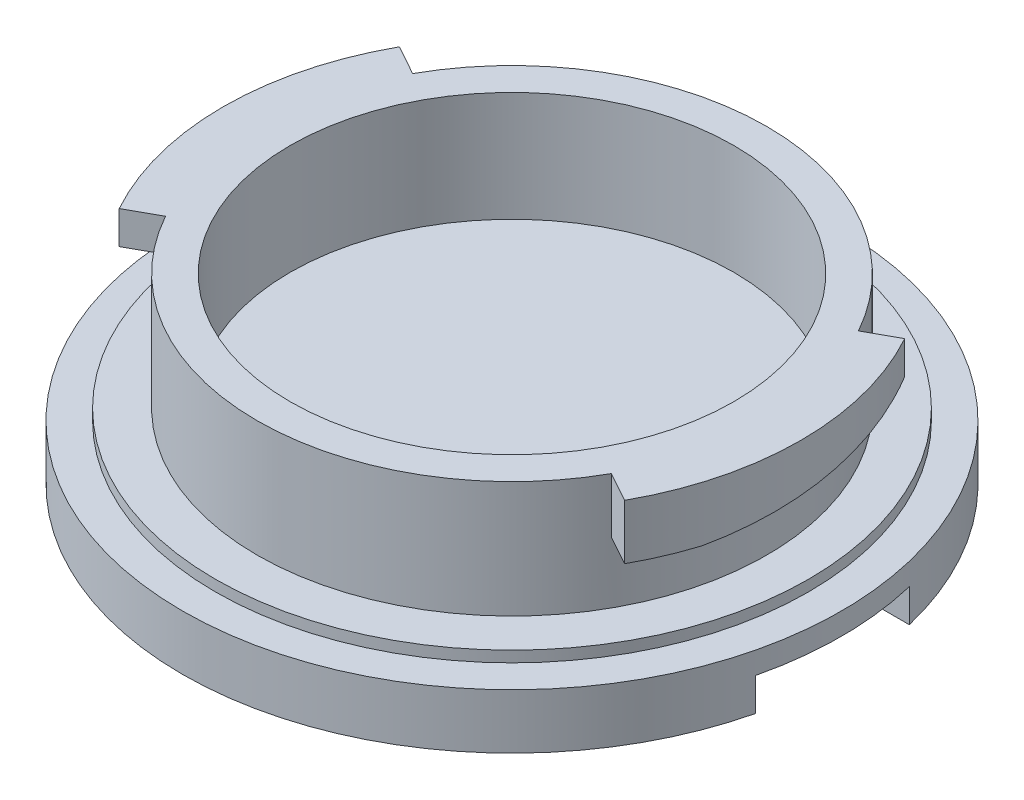
ISO-10303-21;
HEADER;
FILE_DESCRIPTION(('STEP AP214'),'2;1');
FILE_NAME('part.step','',(''),(''),'','','');
FILE_SCHEMA(('AUTOMOTIVE_DESIGN { 1 0 10303 214 1 1 1 1 }'));
ENDSEC;
DATA;
#1=APPLICATION_CONTEXT('core data for automotive mechanical design processes');
#2=APPLICATION_PROTOCOL_DEFINITION('international standard','automotive_design',2000,#1);
#3=PRODUCT_CONTEXT('',#1,'mechanical');
#4=PRODUCT('Part','Part','',(#3));
#5=PRODUCT_RELATED_PRODUCT_CATEGORY('part','',(#4));
#6=PRODUCT_DEFINITION_FORMATION('','',#4);
#7=PRODUCT_DEFINITION_CONTEXT('part definition',#1,'design');
#8=PRODUCT_DEFINITION('design','',#6,#7);
#9=PRODUCT_DEFINITION_SHAPE('','',#8);
#10=(LENGTH_UNIT() NAMED_UNIT(*) SI_UNIT(.MILLI.,.METRE.));
#11=(NAMED_UNIT(*) PLANE_ANGLE_UNIT() SI_UNIT($,.RADIAN.));
#12=(NAMED_UNIT(*) SI_UNIT($,.STERADIAN.) SOLID_ANGLE_UNIT());
#13=UNCERTAINTY_MEASURE_WITH_UNIT(LENGTH_MEASURE(1.E-05),#10,'distance_accuracy_value','');
#14=(GEOMETRIC_REPRESENTATION_CONTEXT(3) GLOBAL_UNCERTAINTY_ASSIGNED_CONTEXT((#13)) GLOBAL_UNIT_ASSIGNED_CONTEXT((#10,
#11,#12)) REPRESENTATION_CONTEXT('',''));
#15=CARTESIAN_POINT('',(0.,0.,0.));
#16=DIRECTION('',(0.,0.,1.));
#17=DIRECTION('',(1.,0.,0.));
#18=AXIS2_PLACEMENT_3D('',#15,#16,#17);
#19=CARTESIAN_POINT('',(0.,0.,0.));
#20=DIRECTION('',(0.,1.,0.));
#21=DIRECTION('',(0.,0.,1.));
#22=AXIS2_PLACEMENT_3D('',#19,#20,#21);
#23=PLANE('',#22);
#24=CARTESIAN_POINT('',(0.,0.,0.));
#25=DIRECTION('',(0.,-1.,0.));
#26=DIRECTION('',(0.,0.,-1.));
#27=AXIS2_PLACEMENT_3D('',#24,#25,#26);
#28=CIRCLE('',#27,10.);
#29=CARTESIAN_POINT('',(9.79795897113271,0.,2.));
#30=VERTEX_POINT('',#29);
#31=CARTESIAN_POINT('',(-9.79795897113271,0.,2.));
#32=VERTEX_POINT('',#31);
#33=EDGE_CURVE('E294',#30,#32,#28,.T.);
#34=ORIENTED_EDGE('',*,*,#33,.F.);
#35=DIRECTION('',(1.,0.,0.));
#36=VECTOR('',#35,1.);
#37=CARTESIAN_POINT('',(0.,0.,2.));
#38=LINE('',#37,#36);
#39=EDGE_CURVE('E298',#32,#30,#38,.T.);
#40=ORIENTED_EDGE('',*,*,#39,.F.);
#41=EDGE_LOOP('',(#34,#40));
#42=FACE_BOUND('',#41,.T.);
#43=DIRECTION('',(1.,0.,0.));
#44=VECTOR('',#43,1.);
#45=CARTESIAN_POINT('',(0.,0.,-2.));
#46=LINE('',#45,#44);
#47=CARTESIAN_POINT('',(-9.79795897113271,0.,-2.));
#48=VERTEX_POINT('',#47);
#49=CARTESIAN_POINT('',(9.79795897113271,0.,-2.));
#50=VERTEX_POINT('',#49);
#51=EDGE_CURVE('E284',#48,#50,#46,.T.);
#52=ORIENTED_EDGE('',*,*,#51,.T.);
#53=CARTESIAN_POINT('',(0.,0.,0.));
#54=DIRECTION('',(0.,-1.,0.));
#55=DIRECTION('',(0.,0.,-1.));
#56=AXIS2_PLACEMENT_3D('',#53,#54,#55);
#57=CIRCLE('',#56,10.);
#58=EDGE_CURVE('E311',#48,#50,#57,.T.);
#59=ORIENTED_EDGE('',*,*,#58,.F.);
#60=EDGE_LOOP('',(#52,#59));
#61=FACE_BOUND('',#60,.T.);
#62=DIRECTION('',(1.,0.,0.));
#63=VECTOR('',#62,1.);
#64=CARTESIAN_POINT('',(0.,0.,3.5));
#65=LINE('',#64,#63);
#66=CARTESIAN_POINT('',(13.,0.,3.5));
#67=VERTEX_POINT('',#66);
#68=CARTESIAN_POINT('',(14.5859521458148,0.,3.5));
#69=VERTEX_POINT('',#68);
#70=EDGE_CURVE('E238',#67,#69,#65,.T.);
#71=ORIENTED_EDGE('',*,*,#70,.T.);
#72=CARTESIAN_POINT('',(0.,0.,0.));
#73=DIRECTION('',(0.,1.,0.));
#74=DIRECTION('',(0.,0.,1.));
#75=AXIS2_PLACEMENT_3D('',#72,#73,#74);
#76=CIRCLE('',#75,15.);
#77=CARTESIAN_POINT('',(-14.5859521458148,0.,3.5));
#78=VERTEX_POINT('',#77);
#79=EDGE_CURVE('E210',#78,#69,#76,.T.);
#80=ORIENTED_EDGE('',*,*,#79,.F.);
#81=DIRECTION('',(-1.,0.,0.));
#82=VECTOR('',#81,1.);
#83=CARTESIAN_POINT('',(0.,0.,3.5));
#84=LINE('',#83,#82);
#85=CARTESIAN_POINT('',(-13.,0.,3.5));
#86=VERTEX_POINT('',#85);
#87=EDGE_CURVE('E223',#86,#78,#84,.T.);
#88=ORIENTED_EDGE('',*,*,#87,.F.);
#89=DIRECTION('',(0.,0.,1.));
#90=VECTOR('',#89,1.);
#91=CARTESIAN_POINT('',(-13.,0.,0.));
#92=LINE('',#91,#90);
#93=CARTESIAN_POINT('',(-13.,0.,-3.5));
#94=VERTEX_POINT('',#93);
#95=EDGE_CURVE('E232',#94,#86,#92,.T.);
#96=ORIENTED_EDGE('',*,*,#95,.F.);
#97=DIRECTION('',(-1.,0.,0.));
#98=VECTOR('',#97,1.);
#99=CARTESIAN_POINT('',(0.,0.,-3.5));
#100=LINE('',#99,#98);
#101=CARTESIAN_POINT('',(-14.5859521458148,0.,-3.5));
#102=VERTEX_POINT('',#101);
#103=EDGE_CURVE('E229',#94,#102,#100,.T.);
#104=ORIENTED_EDGE('',*,*,#103,.T.);
#105=CARTESIAN_POINT('',(14.5859521458148,0.,-3.5));
#106=VERTEX_POINT('',#105);
#107=EDGE_CURVE('E343',#106,#102,#76,.T.);
#108=ORIENTED_EDGE('',*,*,#107,.F.);
#109=DIRECTION('',(1.,0.,0.));
#110=VECTOR('',#109,1.);
#111=CARTESIAN_POINT('',(0.,0.,-3.5));
#112=LINE('',#111,#110);
#113=CARTESIAN_POINT('',(13.,0.,-3.5));
#114=VERTEX_POINT('',#113);
#115=EDGE_CURVE('E195',#114,#106,#112,.T.);
#116=ORIENTED_EDGE('',*,*,#115,.F.);
#117=DIRECTION('',(0.,0.,1.));
#118=VECTOR('',#117,1.);
#119=CARTESIAN_POINT('',(13.,0.,0.));
#120=LINE('',#119,#118);
#121=EDGE_CURVE('E736',#114,#67,#120,.T.);
#122=ORIENTED_EDGE('',*,*,#121,.T.);
#123=EDGE_LOOP('',(#71,#80,#88,#96,#104,#108,#116,#122));
#124=FACE_BOUND('',#123,.T.);
#125=ADVANCED_FACE('F37',(#42,#61,#124),#23,.F.);
#126=CARTESIAN_POINT('',(0.,2.5,0.));
#127=DIRECTION('',(0.,-1.,0.));
#128=DIRECTION('',(0.,0.,-1.));
#129=AXIS2_PLACEMENT_3D('',#126,#127,#128);
#130=CYLINDRICAL_SURFACE('',#129,15.);
#131=CARTESIAN_POINT('',(0.,2.5,0.));
#132=DIRECTION('',(0.,1.,0.));
#133=DIRECTION('',(0.,0.,1.));
#134=AXIS2_PLACEMENT_3D('',#131,#132,#133);
#135=CIRCLE('',#134,15.);
#136=CARTESIAN_POINT('',(0.,2.5,15.));
#137=VERTEX_POINT('',#136);
#138=EDGE_CURVE('E340',#137,#137,#135,.T.);
#139=ORIENTED_EDGE('',*,*,#138,.F.);
#140=EDGE_LOOP('',(#139));
#141=FACE_BOUND('',#140,.T.);
#142=DIRECTION('',(0.,-1.,0.));
#143=VECTOR('',#142,1.);
#144=CARTESIAN_POINT('',(14.5859521458148,1.5,3.5));
#145=LINE('',#144,#143);
#146=CARTESIAN_POINT('',(14.5859521458148,1.5,3.5));
#147=VERTEX_POINT('',#146);
#148=EDGE_CURVE('E189',#147,#69,#145,.T.);
#149=ORIENTED_EDGE('',*,*,#148,.F.);
#150=CARTESIAN_POINT('',(0.,1.5,0.));
#151=DIRECTION('',(0.,-1.,0.));
#152=DIRECTION('',(0.,0.,-1.));
#153=AXIS2_PLACEMENT_3D('',#150,#151,#152);
#154=CIRCLE('',#153,15.);
#155=CARTESIAN_POINT('',(14.5859521458148,1.5,-3.5));
#156=VERTEX_POINT('',#155);
#157=EDGE_CURVE('E198',#156,#147,#154,.T.);
#158=ORIENTED_EDGE('',*,*,#157,.F.);
#159=DIRECTION('',(0.,-1.,0.));
#160=VECTOR('',#159,1.);
#161=CARTESIAN_POINT('',(14.5859521458148,1.5,-3.5));
#162=LINE('',#161,#160);
#163=EDGE_CURVE('E204',#156,#106,#162,.T.);
#164=ORIENTED_EDGE('',*,*,#163,.T.);
#165=ORIENTED_EDGE('',*,*,#107,.T.);
#166=DIRECTION('',(0.,-1.,0.));
#167=VECTOR('',#166,1.);
#168=CARTESIAN_POINT('',(-14.5859521458148,1.5,-3.5));
#169=LINE('',#168,#167);
#170=CARTESIAN_POINT('',(-14.5859521458148,1.5,-3.5));
#171=VERTEX_POINT('',#170);
#172=EDGE_CURVE('E236',#171,#102,#169,.T.);
#173=ORIENTED_EDGE('',*,*,#172,.F.);
#174=CARTESIAN_POINT('',(0.,1.5,0.));
#175=DIRECTION('',(0.,-1.,0.));
#176=DIRECTION('',(0.,0.,-1.));
#177=AXIS2_PLACEMENT_3D('',#174,#175,#176);
#178=CIRCLE('',#177,15.);
#179=CARTESIAN_POINT('',(-14.5859521458148,1.5,3.5));
#180=VERTEX_POINT('',#179);
#181=EDGE_CURVE('E225',#180,#171,#178,.T.);
#182=ORIENTED_EDGE('',*,*,#181,.F.);
#183=DIRECTION('',(0.,-1.,0.));
#184=VECTOR('',#183,1.);
#185=CARTESIAN_POINT('',(-14.5859521458148,1.5,3.5));
#186=LINE('',#185,#184);
#187=EDGE_CURVE('E228',#180,#78,#186,.T.);
#188=ORIENTED_EDGE('',*,*,#187,.T.);
#189=ORIENTED_EDGE('',*,*,#79,.T.);
#190=EDGE_LOOP('',(#149,#158,#164,#165,#173,#182,#188,#189));
#191=FACE_BOUND('',#190,.T.);
#192=ADVANCED_FACE('F207',(#141,#191),#130,.T.);
#193=CARTESIAN_POINT('',(0.,2.5,0.));
#194=DIRECTION('',(0.,1.,0.));
#195=DIRECTION('',(0.,0.,1.));
#196=AXIS2_PLACEMENT_3D('',#193,#194,#195);
#197=PLANE('',#196);
#198=CARTESIAN_POINT('',(0.,2.5,0.));
#199=DIRECTION('',(0.,1.,0.));
#200=DIRECTION('',(0.,0.,1.));
#201=AXIS2_PLACEMENT_3D('',#198,#199,#200);
#202=CIRCLE('',#201,13.5);
#203=CARTESIAN_POINT('',(0.,2.5,13.5));
#204=VERTEX_POINT('',#203);
#205=EDGE_CURVE('E335',#204,#204,#202,.T.);
#206=ORIENTED_EDGE('',*,*,#205,.F.);
#207=EDGE_LOOP('',(#206));
#208=FACE_BOUND('',#207,.T.);
#209=ORIENTED_EDGE('',*,*,#138,.T.);
#210=EDGE_LOOP('',(#209));
#211=FACE_BOUND('',#210,.T.);
#212=ADVANCED_FACE('F428',(#208,#211),#197,.T.);
#213=CARTESIAN_POINT('',(0.,3.,0.));
#214=DIRECTION('',(0.,-1.,0.));
#215=DIRECTION('',(0.,0.,-1.));
#216=AXIS2_PLACEMENT_3D('',#213,#214,#215);
#217=CYLINDRICAL_SURFACE('',#216,13.5);
#218=CARTESIAN_POINT('',(0.,3.,0.));
#219=DIRECTION('',(0.,1.,0.));
#220=DIRECTION('',(0.,0.,1.));
#221=AXIS2_PLACEMENT_3D('',#218,#219,#220);
#222=CIRCLE('',#221,13.5);
#223=CARTESIAN_POINT('',(0.,3.,13.5));
#224=VERTEX_POINT('',#223);
#225=EDGE_CURVE('E331',#224,#224,#222,.T.);
#226=ORIENTED_EDGE('',*,*,#225,.F.);
#227=EDGE_LOOP('',(#226));
#228=FACE_BOUND('',#227,.T.);
#229=ORIENTED_EDGE('',*,*,#205,.T.);
#230=EDGE_LOOP('',(#229));
#231=FACE_BOUND('',#230,.T.);
#232=ADVANCED_FACE('F693',(#228,#231),#217,.T.);
#233=CARTESIAN_POINT('',(0.,3.,0.));
#234=DIRECTION('',(0.,1.,0.));
#235=DIRECTION('',(0.,0.,1.));
#236=AXIS2_PLACEMENT_3D('',#233,#234,#235);
#237=PLANE('',#236);
#238=CARTESIAN_POINT('',(0.,3.,0.));
#239=DIRECTION('',(0.,1.,0.));
#240=DIRECTION('',(0.,0.,1.));
#241=AXIS2_PLACEMENT_3D('',#238,#239,#240);
#242=CIRCLE('',#241,11.6);
#243=CARTESIAN_POINT('',(0.,3.,11.6));
#244=VERTEX_POINT('',#243);
#245=EDGE_CURVE('E332',#244,#244,#242,.T.);
#246=ORIENTED_EDGE('',*,*,#245,.F.);
#247=EDGE_LOOP('',(#246));
#248=FACE_BOUND('',#247,.T.);
#249=ORIENTED_EDGE('',*,*,#225,.T.);
#250=EDGE_LOOP('',(#249));
#251=FACE_BOUND('',#250,.T.);
#252=ADVANCED_FACE('F514',(#248,#251),#237,.T.);
#253=CARTESIAN_POINT('',(0.,8.3,0.));
#254=DIRECTION('',(0.,-1.,0.));
#255=DIRECTION('',(0.,0.,-1.));
#256=AXIS2_PLACEMENT_3D('',#253,#254,#255);
#257=CYLINDRICAL_SURFACE('',#256,11.6);
#258=CARTESIAN_POINT('',(0.,5.8,0.));
#259=DIRECTION('',(0.,1.,0.));
#260=DIRECTION('',(0.,0.,1.));
#261=AXIS2_PLACEMENT_3D('',#258,#259,#260);
#262=CIRCLE('',#261,11.6);
#263=CARTESIAN_POINT('',(-10.145588602817,5.8,-5.62379159485745));
#264=VERTEX_POINT('',#263);
#265=CARTESIAN_POINT('',(-10.4166563771417,5.8,-5.10424038624296));
#266=VERTEX_POINT('',#265);
#267=EDGE_CURVE('E247',#264,#266,#262,.T.);
#268=ORIENTED_EDGE('',*,*,#267,.F.);
#269=DIRECTION('',(0.,1.,0.));
#270=VECTOR('',#269,1.);
#271=CARTESIAN_POINT('',(-10.145588602817,5.8,-5.62379159485745));
#272=LINE('',#271,#270);
#273=CARTESIAN_POINT('',(-10.145588602817,8.3,-5.62379159485745));
#274=VERTEX_POINT('',#273);
#275=EDGE_CURVE('E255',#264,#274,#272,.T.);
#276=ORIENTED_EDGE('',*,*,#275,.T.);
#277=CARTESIAN_POINT('',(0.,8.3,0.));
#278=DIRECTION('',(0.,1.,0.));
#279=DIRECTION('',(0.,0.,1.));
#280=AXIS2_PLACEMENT_3D('',#277,#278,#279);
#281=CIRCLE('',#280,11.6);
#282=CARTESIAN_POINT('',(10.145588602817,8.3,-5.62379159485753));
#283=VERTEX_POINT('',#282);
#284=EDGE_CURVE('E328',#283,#274,#281,.T.);
#285=ORIENTED_EDGE('',*,*,#284,.F.);
#286=DIRECTION('',(0.,1.,0.));
#287=VECTOR('',#286,1.);
#288=CARTESIAN_POINT('',(10.145588602817,5.8,-5.62379159485753));
#289=LINE('',#288,#287);
#290=CARTESIAN_POINT('',(10.145588602817,6.80000000000007,-5.62379159485753));
#291=VERTEX_POINT('',#290);
#292=EDGE_CURVE('E285',#291,#283,#289,.T.);
#293=ORIENTED_EDGE('',*,*,#292,.F.);
#294=CARTESIAN_POINT('',(0.,6.80000000000007,0.));
#295=DIRECTION('',(0.050676404581723,0.994521895368274,0.0914226539308835));
#296=DIRECTION('',(0.482153782420162,-0.10452846326765,0.869828448870716));
#297=AXIS2_PLACEMENT_3D('',#294,#295,#296);
#298=ELLIPSE('',#297,11.6638960429368,11.6);
#299=CARTESIAN_POINT('',(10.4166563771417,5.8,5.10424038624288));
#300=VERTEX_POINT('',#299);
#301=EDGE_CURVE('E11',#291,#300,#298,.F.);
#302=ORIENTED_EDGE('',*,*,#301,.T.);
#303=CARTESIAN_POINT('',(0.,5.8,0.));
#304=DIRECTION('',(0.,1.,0.));
#305=DIRECTION('',(0.,0.,1.));
#306=AXIS2_PLACEMENT_3D('',#303,#304,#305);
#307=CIRCLE('',#306,11.6);
#308=CARTESIAN_POINT('',(10.145588602817,5.8,5.62379159485752));
#309=VERTEX_POINT('',#308);
#310=EDGE_CURVE('E270',#309,#300,#307,.T.);
#311=ORIENTED_EDGE('',*,*,#310,.F.);
#312=DIRECTION('',(0.,1.,0.));
#313=VECTOR('',#312,1.);
#314=CARTESIAN_POINT('',(10.145588602817,5.8,5.62379159485752));
#315=LINE('',#314,#313);
#316=CARTESIAN_POINT('',(10.145588602817,8.3,5.62379159485752));
#317=VERTEX_POINT('',#316);
#318=EDGE_CURVE('E281',#309,#317,#315,.T.);
#319=ORIENTED_EDGE('',*,*,#318,.T.);
#320=CARTESIAN_POINT('',(-10.145588602817,8.3,5.62379159485745));
#321=VERTEX_POINT('',#320);
#322=EDGE_CURVE('E325',#321,#317,#281,.T.);
#323=ORIENTED_EDGE('',*,*,#322,.F.);
#324=DIRECTION('',(0.,1.,0.));
#325=VECTOR('',#324,1.);
#326=CARTESIAN_POINT('',(-10.145588602817,5.8,5.62379159485745));
#327=LINE('',#326,#325);
#328=CARTESIAN_POINT('',(-10.145588602817,6.80000000000007,5.62379159485745));
#329=VERTEX_POINT('',#328);
#330=EDGE_CURVE('E259',#329,#321,#327,.T.);
#331=ORIENTED_EDGE('',*,*,#330,.F.);
#332=CARTESIAN_POINT('',(0.,6.80000000000007,0.));
#333=DIRECTION('',(-0.0506764045817223,0.994521895368274,-0.0914226539308838));
#334=DIRECTION('',(-0.482153782420155,-0.10452846326765,-0.869828448870719));
#335=AXIS2_PLACEMENT_3D('',#332,#333,#334);
#336=ELLIPSE('',#335,11.6638960429368,11.6);
#337=EDGE_CURVE('E45',#329,#266,#336,.F.);
#338=ORIENTED_EDGE('',*,*,#337,.T.);
#339=EDGE_LOOP('',(#268,#276,#285,#293,#302,#311,#319,#323,#331,#338));
#340=FACE_BOUND('',#339,.T.);
#341=ORIENTED_EDGE('',*,*,#245,.T.);
#342=EDGE_LOOP('',(#341));
#343=FACE_BOUND('',#342,.T.);
#344=ADVANCED_FACE('F372',(#340,#343),#257,.T.);
#345=CARTESIAN_POINT('',(0.,8.3,0.));
#346=DIRECTION('',(0.,1.,0.));
#347=DIRECTION('',(0.,0.,1.));
#348=AXIS2_PLACEMENT_3D('',#345,#346,#347);
#349=PLANE('',#348);
#350=CARTESIAN_POINT('',(0.,8.3,0.));
#351=DIRECTION('',(0.,1.,0.));
#352=DIRECTION('',(0.,0.,1.));
#353=AXIS2_PLACEMENT_3D('',#350,#351,#352);
#354=CIRCLE('',#353,10.1);
#355=CARTESIAN_POINT('',(0.,8.3,10.1));
#356=VERTEX_POINT('',#355);
#357=EDGE_CURVE('E305',#356,#356,#354,.T.);
#358=ORIENTED_EDGE('',*,*,#357,.F.);
#359=EDGE_LOOP('',(#358));
#360=FACE_BOUND('',#359,.T.);
#361=ORIENTED_EDGE('',*,*,#284,.T.);
#362=DIRECTION('',(-0.874619707139399,0.,-0.484809620246332));
#363=VECTOR('',#362,1.);
#364=CARTESIAN_POINT('',(0.,8.3,0.));
#365=LINE('',#364,#363);
#366=CARTESIAN_POINT('',(-11.5012491488831,8.3,-6.37524650623926));
#367=VERTEX_POINT('',#366);
#368=EDGE_CURVE('E211',#274,#367,#365,.T.);
#369=ORIENTED_EDGE('',*,*,#368,.T.);
#370=CARTESIAN_POINT('',(0.,8.3,0.));
#371=DIRECTION('',(0.,1.,0.));
#372=DIRECTION('',(0.,0.,1.));
#373=AXIS2_PLACEMENT_3D('',#370,#371,#372);
#374=CIRCLE('',#373,13.15);
#375=CARTESIAN_POINT('',(-11.5012491488831,8.3,6.37524650623926));
#376=VERTEX_POINT('',#375);
#377=EDGE_CURVE('E214',#367,#376,#374,.T.);
#378=ORIENTED_EDGE('',*,*,#377,.T.);
#379=DIRECTION('',(-0.874619707139399,0.,0.484809620246332));
#380=VECTOR('',#379,1.);
#381=CARTESIAN_POINT('',(0.,8.3,0.));
#382=LINE('',#381,#380);
#383=EDGE_CURVE('E244',#321,#376,#382,.T.);
#384=ORIENTED_EDGE('',*,*,#383,.F.);
#385=ORIENTED_EDGE('',*,*,#322,.T.);
#386=DIRECTION('',(0.874619707139395,0.,0.484809620246338));
#387=VECTOR('',#386,1.);
#388=CARTESIAN_POINT('',(0.,8.3,0.));
#389=LINE('',#388,#387);
#390=CARTESIAN_POINT('',(11.501249148883,8.3,6.37524650623935));
#391=VERTEX_POINT('',#390);
#392=EDGE_CURVE('E258',#317,#391,#389,.T.);
#393=ORIENTED_EDGE('',*,*,#392,.T.);
#394=CARTESIAN_POINT('',(0.,8.3,0.));
#395=DIRECTION('',(0.,1.,0.));
#396=DIRECTION('',(0.,0.,1.));
#397=AXIS2_PLACEMENT_3D('',#394,#395,#396);
#398=CIRCLE('',#397,13.15);
#399=CARTESIAN_POINT('',(11.501249148883,8.3,-6.37524650623935));
#400=VERTEX_POINT('',#399);
#401=EDGE_CURVE('E276',#391,#400,#398,.T.);
#402=ORIENTED_EDGE('',*,*,#401,.T.);
#403=DIRECTION('',(0.874619707139395,0.,-0.484809620246339));
#404=VECTOR('',#403,1.);
#405=CARTESIAN_POINT('',(0.,8.3,0.));
#406=LINE('',#405,#404);
#407=EDGE_CURVE('E268',#283,#400,#406,.T.);
#408=ORIENTED_EDGE('',*,*,#407,.F.);
#409=EDGE_LOOP('',(#361,#369,#378,#384,#385,#393,#402,#408));
#410=FACE_BOUND('',#409,.T.);
#411=ADVANCED_FACE('F391',(#360,#410),#349,.T.);
#412=CARTESIAN_POINT('',(0.,3.3,0.));
#413=DIRECTION('',(0.,1.,0.));
#414=DIRECTION('',(0.,0.,1.));
#415=AXIS2_PLACEMENT_3D('',#412,#413,#414);
#416=CYLINDRICAL_SURFACE('',#415,10.1);
#417=CARTESIAN_POINT('',(0.,3.3,0.));
#418=DIRECTION('',(0.,1.,0.));
#419=DIRECTION('',(0.,0.,1.));
#420=AXIS2_PLACEMENT_3D('',#417,#418,#419);
#421=CIRCLE('',#420,10.1);
#422=CARTESIAN_POINT('',(0.,3.3,10.1));
#423=VERTEX_POINT('',#422);
#424=EDGE_CURVE('E322',#423,#423,#421,.T.);
#425=ORIENTED_EDGE('',*,*,#424,.F.);
#426=EDGE_LOOP('',(#425));
#427=FACE_BOUND('',#426,.T.);
#428=ORIENTED_EDGE('',*,*,#357,.T.);
#429=EDGE_LOOP('',(#428));
#430=FACE_BOUND('',#429,.T.);
#431=ADVANCED_FACE('F610',(#427,#430),#416,.F.);
#432=CARTESIAN_POINT('',(0.,3.3,0.));
#433=DIRECTION('',(0.,1.,0.));
#434=DIRECTION('',(0.,0.,1.));
#435=AXIS2_PLACEMENT_3D('',#432,#433,#434);
#436=PLANE('',#435);
#437=ORIENTED_EDGE('',*,*,#424,.T.);
#438=EDGE_LOOP('',(#437));
#439=FACE_BOUND('',#438,.T.);
#440=ADVANCED_FACE('F668',(#439),#436,.T.);
#441=CARTESIAN_POINT('',(0.,2.,-2.));
#442=DIRECTION('',(0.,0.,-1.));
#443=DIRECTION('',(-1.,0.,0.));
#444=AXIS2_PLACEMENT_3D('',#441,#442,#443);
#445=PLANE('',#444);
#446=ORIENTED_EDGE('',*,*,#51,.F.);
#447=DIRECTION('',(0.,-1.,0.));
#448=VECTOR('',#447,1.);
#449=CARTESIAN_POINT('',(-9.79795897113271,2.,-2.));
#450=LINE('',#449,#448);
#451=CARTESIAN_POINT('',(-9.79795897113271,2.,-2.));
#452=VERTEX_POINT('',#451);
#453=EDGE_CURVE('E314',#452,#48,#450,.T.);
#454=ORIENTED_EDGE('',*,*,#453,.F.);
#455=DIRECTION('',(1.,0.,0.));
#456=VECTOR('',#455,1.);
#457=CARTESIAN_POINT('',(0.,2.,-2.));
#458=LINE('',#457,#456);
#459=CARTESIAN_POINT('',(9.79795897113271,2.,-2.));
#460=VERTEX_POINT('',#459);
#461=EDGE_CURVE('E308',#452,#460,#458,.T.);
#462=ORIENTED_EDGE('',*,*,#461,.T.);
#463=DIRECTION('',(0.,-1.,0.));
#464=VECTOR('',#463,1.);
#465=CARTESIAN_POINT('',(9.79795897113271,2.,-2.));
#466=LINE('',#465,#464);
#467=EDGE_CURVE('E300',#460,#50,#466,.T.);
#468=ORIENTED_EDGE('',*,*,#467,.T.);
#469=EDGE_LOOP('',(#446,#454,#462,#468));
#470=FACE_BOUND('',#469,.T.);
#471=ADVANCED_FACE('F658',(#470),#445,.T.);
#472=CARTESIAN_POINT('',(0.,2.,0.));
#473=DIRECTION('',(0.,-1.,0.));
#474=DIRECTION('',(0.,0.,-1.));
#475=AXIS2_PLACEMENT_3D('',#472,#473,#474);
#476=CYLINDRICAL_SURFACE('',#475,10.);
#477=ORIENTED_EDGE('',*,*,#58,.T.);
#478=ORIENTED_EDGE('',*,*,#467,.F.);
#479=CARTESIAN_POINT('',(0.,2.,0.));
#480=DIRECTION('',(0.,-1.,0.));
#481=DIRECTION('',(0.,0.,-1.));
#482=AXIS2_PLACEMENT_3D('',#479,#480,#481);
#483=CIRCLE('',#482,10.);
#484=EDGE_CURVE('E310',#452,#460,#483,.T.);
#485=ORIENTED_EDGE('',*,*,#484,.F.);
#486=ORIENTED_EDGE('',*,*,#453,.T.);
#487=EDGE_LOOP('',(#477,#478,#485,#486));
#488=FACE_BOUND('',#487,.T.);
#489=ADVANCED_FACE('F648',(#488),#476,.F.);
#490=CARTESIAN_POINT('',(0.,2.,0.));
#491=DIRECTION('',(0.,-1.,0.));
#492=DIRECTION('',(0.,0.,-1.));
#493=AXIS2_PLACEMENT_3D('',#490,#491,#492);
#494=PLANE('',#493);
#495=ORIENTED_EDGE('',*,*,#461,.F.);
#496=ORIENTED_EDGE('',*,*,#484,.T.);
#497=EDGE_LOOP('',(#495,#496));
#498=FACE_BOUND('',#497,.T.);
#499=ADVANCED_FACE('F638',(#498),#494,.T.);
#500=CARTESIAN_POINT('',(0.,2.,2.));
#501=DIRECTION('',(0.,0.,-1.));
#502=DIRECTION('',(-1.,0.,0.));
#503=AXIS2_PLACEMENT_3D('',#500,#501,#502);
#504=PLANE('',#503);
#505=ORIENTED_EDGE('',*,*,#39,.T.);
#506=DIRECTION('',(0.,-1.,0.));
#507=VECTOR('',#506,1.);
#508=CARTESIAN_POINT('',(9.79795897113271,2.,2.));
#509=LINE('',#508,#507);
#510=CARTESIAN_POINT('',(9.79795897113271,2.,2.));
#511=VERTEX_POINT('',#510);
#512=EDGE_CURVE('E297',#511,#30,#509,.T.);
#513=ORIENTED_EDGE('',*,*,#512,.F.);
#514=DIRECTION('',(1.,0.,0.));
#515=VECTOR('',#514,1.);
#516=CARTESIAN_POINT('',(0.,2.,2.));
#517=LINE('',#516,#515);
#518=CARTESIAN_POINT('',(-9.79795897113271,2.,2.));
#519=VERTEX_POINT('',#518);
#520=EDGE_CURVE('E290',#519,#511,#517,.T.);
#521=ORIENTED_EDGE('',*,*,#520,.F.);
#522=DIRECTION('',(0.,-1.,0.));
#523=VECTOR('',#522,1.);
#524=CARTESIAN_POINT('',(-9.79795897113271,2.,2.));
#525=LINE('',#524,#523);
#526=EDGE_CURVE('E303',#519,#32,#525,.T.);
#527=ORIENTED_EDGE('',*,*,#526,.T.);
#528=EDGE_LOOP('',(#505,#513,#521,#527));
#529=FACE_BOUND('',#528,.T.);
#530=ADVANCED_FACE('F628',(#529),#504,.F.);
#531=CARTESIAN_POINT('',(0.,2.,0.));
#532=DIRECTION('',(0.,-1.,0.));
#533=DIRECTION('',(0.,0.,-1.));
#534=AXIS2_PLACEMENT_3D('',#531,#532,#533);
#535=CYLINDRICAL_SURFACE('',#534,10.);
#536=ORIENTED_EDGE('',*,*,#33,.T.);
#537=ORIENTED_EDGE('',*,*,#526,.F.);
#538=CARTESIAN_POINT('',(0.,2.,0.));
#539=DIRECTION('',(0.,-1.,0.));
#540=DIRECTION('',(0.,0.,-1.));
#541=AXIS2_PLACEMENT_3D('',#538,#539,#540);
#542=CIRCLE('',#541,10.);
#543=EDGE_CURVE('E293',#511,#519,#542,.T.);
#544=ORIENTED_EDGE('',*,*,#543,.F.);
#545=ORIENTED_EDGE('',*,*,#512,.T.);
#546=EDGE_LOOP('',(#536,#537,#544,#545));
#547=FACE_BOUND('',#546,.T.);
#548=ADVANCED_FACE('F418',(#547),#535,.F.);
#549=CARTESIAN_POINT('',(0.,2.,0.));
#550=DIRECTION('',(0.,-1.,0.));
#551=DIRECTION('',(0.,0.,-1.));
#552=AXIS2_PLACEMENT_3D('',#549,#550,#551);
#553=PLANE('',#552);
#554=ORIENTED_EDGE('',*,*,#520,.T.);
#555=ORIENTED_EDGE('',*,*,#543,.T.);
#556=EDGE_LOOP('',(#554,#555));
#557=FACE_BOUND('',#556,.T.);
#558=ADVANCED_FACE('F411',(#557),#553,.T.);
#559=CARTESIAN_POINT('',(0.,5.8,0.));
#560=DIRECTION('',(-0.484809620246338,0.,0.874619707139395));
#561=DIRECTION('',(0.874619707139395,0.,0.484809620246338));
#562=AXIS2_PLACEMENT_3D('',#559,#560,#561);
#563=PLANE('',#562);
#564=ORIENTED_EDGE('',*,*,#392,.F.);
#565=ORIENTED_EDGE('',*,*,#318,.F.);
#566=DIRECTION('',(0.874619707139395,0.,0.484809620246338));
#567=VECTOR('',#566,1.);
#568=CARTESIAN_POINT('',(0.,5.8,0.));
#569=LINE('',#568,#567);
#570=CARTESIAN_POINT('',(11.501249148883,5.8,6.37524650623935));
#571=VERTEX_POINT('',#570);
#572=EDGE_CURVE('E264',#309,#571,#569,.T.);
#573=ORIENTED_EDGE('',*,*,#572,.T.);
#574=DIRECTION('',(0.,1.,0.));
#575=VECTOR('',#574,1.);
#576=CARTESIAN_POINT('',(11.501249148883,5.8,6.37524650623935));
#577=LINE('',#576,#575);
#578=EDGE_CURVE('E273',#571,#391,#577,.T.);
#579=ORIENTED_EDGE('',*,*,#578,.T.);
#580=EDGE_LOOP('',(#564,#565,#573,#579));
#581=FACE_BOUND('',#580,.T.);
#582=ADVANCED_FACE('F409',(#581),#563,.T.);
#583=CARTESIAN_POINT('',(0.,5.8,0.));
#584=DIRECTION('',(0.484809620246339,0.,0.874619707139395));
#585=DIRECTION('',(0.874619707139395,0.,-0.484809620246339));
#586=AXIS2_PLACEMENT_3D('',#583,#584,#585);
#587=PLANE('',#586);
#588=DIRECTION('',(0.,1.,0.));
#589=VECTOR('',#588,1.);
#590=CARTESIAN_POINT('',(11.501249148883,5.8,-6.37524650623935));
#591=LINE('',#590,#589);
#592=CARTESIAN_POINT('',(11.501249148883,6.80000000000007,-6.37524650623935));
#593=VERTEX_POINT('',#592);
#594=EDGE_CURVE('E287',#593,#400,#591,.T.);
#595=ORIENTED_EDGE('',*,*,#594,.F.);
#596=DIRECTION('',(-0.874619707139395,0.,0.484809620246339));
#597=VECTOR('',#596,1.);
#598=CARTESIAN_POINT('',(0.,6.80000000000007,0.));
#599=LINE('',#598,#597);
#600=EDGE_CURVE('E52',#593,#291,#599,.T.);
#601=ORIENTED_EDGE('',*,*,#600,.T.);
#602=ORIENTED_EDGE('',*,*,#292,.T.);
#603=ORIENTED_EDGE('',*,*,#407,.T.);
#604=EDGE_LOOP('',(#595,#601,#602,#603));
#605=FACE_BOUND('',#604,.T.);
#606=ADVANCED_FACE('F397',(#605),#587,.F.);
#607=CARTESIAN_POINT('',(0.,5.8,0.));
#608=DIRECTION('',(0.,1.,0.));
#609=DIRECTION('',(0.,0.,1.));
#610=AXIS2_PLACEMENT_3D('',#607,#608,#609);
#611=CYLINDRICAL_SURFACE('',#610,13.15);
#612=CARTESIAN_POINT('',(0.,5.8,0.));
#613=DIRECTION('',(0.,1.,0.));
#614=DIRECTION('',(0.,0.,1.));
#615=AXIS2_PLACEMENT_3D('',#612,#613,#614);
#616=CIRCLE('',#615,13.15);
#617=CARTESIAN_POINT('',(12.5519369359035,5.8,3.92063504513011));
#618=VERTEX_POINT('',#617);
#619=EDGE_CURVE('E267',#571,#618,#616,.T.);
#620=ORIENTED_EDGE('',*,*,#619,.T.);
#621=CARTESIAN_POINT('',(0.,6.80000000000007,0.));
#622=DIRECTION('',(0.050676404581723,0.994521895368274,0.0914226539308835));
#623=DIRECTION('',(-0.482153782420162,0.10452846326765,-0.869828448870716));
#624=AXIS2_PLACEMENT_3D('',#621,#622,#623);
#625=ELLIPSE('',#624,13.2224338762602,13.15);
#626=EDGE_CURVE('E60',#618,#593,#625,.T.);
#627=ORIENTED_EDGE('',*,*,#626,.T.);
#628=ORIENTED_EDGE('',*,*,#594,.T.);
#629=ORIENTED_EDGE('',*,*,#401,.F.);
#630=ORIENTED_EDGE('',*,*,#578,.F.);
#631=EDGE_LOOP('',(#620,#627,#628,#629,#630));
#632=FACE_BOUND('',#631,.T.);
#633=ADVANCED_FACE('F406',(#632),#611,.T.);
#634=CARTESIAN_POINT('',(0.,5.8,0.));
#635=DIRECTION('',(0.,1.,0.));
#636=DIRECTION('',(0.,0.,1.));
#637=AXIS2_PLACEMENT_3D('',#634,#635,#636);
#638=PLANE('',#637);
#639=ORIENTED_EDGE('',*,*,#310,.T.);
#640=DIRECTION('',(0.874619707139395,0.,-0.484809620246339));
#641=VECTOR('',#640,1.);
#642=CARTESIAN_POINT('',(4.61265541793736,5.8,8.32145065257042));
#643=LINE('',#642,#641);
#644=EDGE_CURVE('E364',#300,#618,#643,.T.);
#645=ORIENTED_EDGE('',*,*,#644,.T.);
#646=ORIENTED_EDGE('',*,*,#619,.F.);
#647=ORIENTED_EDGE('',*,*,#572,.F.);
#648=EDGE_LOOP('',(#639,#645,#646,#647));
#649=FACE_BOUND('',#648,.T.);
#650=ADVANCED_FACE('F404',(#649),#638,.F.);
#651=CARTESIAN_POINT('',(0.,5.8,0.));
#652=DIRECTION('',(0.484809620246332,0.,-0.874619707139399));
#653=DIRECTION('',(-0.874619707139399,0.,-0.484809620246332));
#654=AXIS2_PLACEMENT_3D('',#651,#652,#653);
#655=PLANE('',#654);
#656=ORIENTED_EDGE('',*,*,#368,.F.);
#657=ORIENTED_EDGE('',*,*,#275,.F.);
#658=DIRECTION('',(-0.874619707139399,0.,-0.484809620246332));
#659=VECTOR('',#658,1.);
#660=CARTESIAN_POINT('',(0.,5.8,0.));
#661=LINE('',#660,#659);
#662=CARTESIAN_POINT('',(-11.5012491488831,5.8,-6.37524650623926));
#663=VERTEX_POINT('',#662);
#664=EDGE_CURVE('E240',#264,#663,#661,.T.);
#665=ORIENTED_EDGE('',*,*,#664,.T.);
#666=DIRECTION('',(0.,1.,0.));
#667=VECTOR('',#666,1.);
#668=CARTESIAN_POINT('',(-11.5012491488831,5.8,-6.37524650623926));
#669=LINE('',#668,#667);
#670=EDGE_CURVE('E249',#663,#367,#669,.T.);
#671=ORIENTED_EDGE('',*,*,#670,.T.);
#672=EDGE_LOOP('',(#656,#657,#665,#671));
#673=FACE_BOUND('',#672,.T.);
#674=ADVANCED_FACE('F393',(#673),#655,.T.);
#675=CARTESIAN_POINT('',(0.,5.8,0.));
#676=DIRECTION('',(-0.484809620246332,0.,-0.874619707139399));
#677=DIRECTION('',(-0.874619707139399,0.,0.484809620246332));
#678=AXIS2_PLACEMENT_3D('',#675,#676,#677);
#679=PLANE('',#678);
#680=DIRECTION('',(0.,1.,0.));
#681=VECTOR('',#680,1.);
#682=CARTESIAN_POINT('',(-11.5012491488831,5.8,6.37524650623926));
#683=LINE('',#682,#681);
#684=CARTESIAN_POINT('',(-11.5012491488831,6.80000000000007,6.37524650623926));
#685=VERTEX_POINT('',#684);
#686=EDGE_CURVE('E261',#685,#376,#683,.T.);
#687=ORIENTED_EDGE('',*,*,#686,.F.);
#688=DIRECTION('',(0.874619707139399,0.,-0.484809620246332));
#689=VECTOR('',#688,1.);
#690=CARTESIAN_POINT('',(0.,6.80000000000007,0.));
#691=LINE('',#690,#689);
#692=EDGE_CURVE('E362',#685,#329,#691,.T.);
#693=ORIENTED_EDGE('',*,*,#692,.T.);
#694=ORIENTED_EDGE('',*,*,#330,.T.);
#695=ORIENTED_EDGE('',*,*,#383,.T.);
#696=EDGE_LOOP('',(#687,#693,#694,#695));
#697=FACE_BOUND('',#696,.T.);
#698=ADVANCED_FACE('F388',(#697),#679,.F.);
#699=CARTESIAN_POINT('',(0.,5.8,0.));
#700=DIRECTION('',(0.,1.,0.));
#701=DIRECTION('',(0.,0.,1.));
#702=AXIS2_PLACEMENT_3D('',#699,#700,#701);
#703=CYLINDRICAL_SURFACE('',#702,13.15);
#704=CARTESIAN_POINT('',(0.,5.8,0.));
#705=DIRECTION('',(0.,1.,0.));
#706=DIRECTION('',(0.,0.,1.));
#707=AXIS2_PLACEMENT_3D('',#704,#705,#706);
#708=CIRCLE('',#707,13.15);
#709=CARTESIAN_POINT('',(-12.5519369359034,5.8,-3.92063504513021));
#710=VERTEX_POINT('',#709);
#711=EDGE_CURVE('E243',#663,#710,#708,.T.);
#712=ORIENTED_EDGE('',*,*,#711,.T.);
#713=CARTESIAN_POINT('',(0.,6.80000000000007,0.));
#714=DIRECTION('',(-0.0506764045817223,0.994521895368274,-0.0914226539308838));
#715=DIRECTION('',(0.482153782420155,0.10452846326765,0.869828448870719));
#716=AXIS2_PLACEMENT_3D('',#713,#714,#715);
#717=ELLIPSE('',#716,13.2224338762602,13.15);
#718=EDGE_CURVE('E360',#710,#685,#717,.T.);
#719=ORIENTED_EDGE('',*,*,#718,.T.);
#720=ORIENTED_EDGE('',*,*,#686,.T.);
#721=ORIENTED_EDGE('',*,*,#377,.F.);
#722=ORIENTED_EDGE('',*,*,#670,.F.);
#723=EDGE_LOOP('',(#712,#719,#720,#721,#722));
#724=FACE_BOUND('',#723,.T.);
#725=ADVANCED_FACE('F385',(#724),#703,.T.);
#726=CARTESIAN_POINT('',(0.,5.8,0.));
#727=DIRECTION('',(0.,1.,0.));
#728=DIRECTION('',(0.,0.,1.));
#729=AXIS2_PLACEMENT_3D('',#726,#727,#728);
#730=PLANE('',#729);
#731=ORIENTED_EDGE('',*,*,#267,.T.);
#732=DIRECTION('',(-0.874619707139399,0.,0.484809620246332));
#733=VECTOR('',#732,1.);
#734=CARTESIAN_POINT('',(-4.61265541793729,5.8,-8.32145065257046));
#735=LINE('',#734,#733);
#736=EDGE_CURVE('E357',#266,#710,#735,.T.);
#737=ORIENTED_EDGE('',*,*,#736,.T.);
#738=ORIENTED_EDGE('',*,*,#711,.F.);
#739=ORIENTED_EDGE('',*,*,#664,.F.);
#740=EDGE_LOOP('',(#731,#737,#738,#739));
#741=FACE_BOUND('',#740,.T.);
#742=ADVANCED_FACE('F380',(#741),#730,.F.);
#743=CARTESIAN_POINT('',(0.,1.5,-3.5));
#744=DIRECTION('',(0.,0.,1.));
#745=DIRECTION('',(1.,0.,0.));
#746=AXIS2_PLACEMENT_3D('',#743,#744,#745);
#747=PLANE('',#746);
#748=ORIENTED_EDGE('',*,*,#103,.F.);
#749=DIRECTION('',(-0.707106781186552,0.707106781186543,0.));
#750=VECTOR('',#749,1.);
#751=CARTESIAN_POINT('',(-7.24999999999992,-5.75000000000001,-3.5));
#752=LINE('',#751,#750);
#753=CARTESIAN_POINT('',(-14.5,1.5,-3.5));
#754=VERTEX_POINT('',#753);
#755=EDGE_CURVE('E355',#94,#754,#752,.T.);
#756=ORIENTED_EDGE('',*,*,#755,.T.);
#757=DIRECTION('',(-1.,0.,0.));
#758=VECTOR('',#757,1.);
#759=CARTESIAN_POINT('',(0.,1.5,-3.5));
#760=LINE('',#759,#758);
#761=EDGE_CURVE('E220',#754,#171,#760,.T.);
#762=ORIENTED_EDGE('',*,*,#761,.T.);
#763=ORIENTED_EDGE('',*,*,#172,.T.);
#764=EDGE_LOOP('',(#748,#756,#762,#763));
#765=FACE_BOUND('',#764,.T.);
#766=ADVANCED_FACE('F463',(#765),#747,.T.);
#767=CARTESIAN_POINT('',(0.,1.5,3.5));
#768=DIRECTION('',(0.,0.,1.));
#769=DIRECTION('',(1.,0.,0.));
#770=AXIS2_PLACEMENT_3D('',#767,#768,#769);
#771=PLANE('',#770);
#772=DIRECTION('',(-1.,0.,0.));
#773=VECTOR('',#772,1.);
#774=CARTESIAN_POINT('',(0.,1.5,3.5));
#775=LINE('',#774,#773);
#776=CARTESIAN_POINT('',(-14.5,1.5,3.5));
#777=VERTEX_POINT('',#776);
#778=EDGE_CURVE('E222',#777,#180,#775,.T.);
#779=ORIENTED_EDGE('',*,*,#778,.F.);
#780=DIRECTION('',(0.707106781186552,-0.707106781186543,0.));
#781=VECTOR('',#780,1.);
#782=CARTESIAN_POINT('',(-14.5,1.5,3.5));
#783=LINE('',#782,#781);
#784=EDGE_CURVE('E353',#777,#86,#783,.T.);
#785=ORIENTED_EDGE('',*,*,#784,.T.);
#786=ORIENTED_EDGE('',*,*,#87,.T.);
#787=ORIENTED_EDGE('',*,*,#187,.F.);
#788=EDGE_LOOP('',(#779,#785,#786,#787));
#789=FACE_BOUND('',#788,.T.);
#790=ADVANCED_FACE('F565',(#789),#771,.F.);
#791=CARTESIAN_POINT('',(0.,1.5,0.));
#792=DIRECTION('',(0.,-1.,0.));
#793=DIRECTION('',(0.,0.,-1.));
#794=AXIS2_PLACEMENT_3D('',#791,#792,#793);
#795=PLANE('',#794);
#796=ORIENTED_EDGE('',*,*,#761,.F.);
#797=DIRECTION('',(0.,0.,1.));
#798=VECTOR('',#797,1.);
#799=CARTESIAN_POINT('',(-14.5,1.5,0.));
#800=LINE('',#799,#798);
#801=EDGE_CURVE('E350',#754,#777,#800,.T.);
#802=ORIENTED_EDGE('',*,*,#801,.T.);
#803=ORIENTED_EDGE('',*,*,#778,.T.);
#804=ORIENTED_EDGE('',*,*,#181,.T.);
#805=EDGE_LOOP('',(#796,#802,#803,#804));
#806=FACE_BOUND('',#805,.T.);
#807=ADVANCED_FACE('F556',(#806),#795,.T.);
#808=CARTESIAN_POINT('',(0.,1.5,3.5));
#809=DIRECTION('',(0.,0.,-1.));
#810=DIRECTION('',(-1.,0.,0.));
#811=AXIS2_PLACEMENT_3D('',#808,#809,#810);
#812=PLANE('',#811);
#813=ORIENTED_EDGE('',*,*,#70,.F.);
#814=DIRECTION('',(-0.707106781186543,-0.707106781186552,0.));
#815=VECTOR('',#814,1.);
#816=CARTESIAN_POINT('',(7.25000000000009,-5.75,3.5));
#817=LINE('',#816,#815);
#818=CARTESIAN_POINT('',(14.5,1.5,3.5));
#819=VERTEX_POINT('',#818);
#820=EDGE_CURVE('E191',#67,#819,#817,.F.);
#821=ORIENTED_EDGE('',*,*,#820,.T.);
#822=DIRECTION('',(1.,0.,0.));
#823=VECTOR('',#822,1.);
#824=CARTESIAN_POINT('',(0.,1.5,3.5));
#825=LINE('',#824,#823);
#826=EDGE_CURVE('E184',#819,#147,#825,.T.);
#827=ORIENTED_EDGE('',*,*,#826,.T.);
#828=ORIENTED_EDGE('',*,*,#148,.T.);
#829=EDGE_LOOP('',(#813,#821,#827,#828));
#830=FACE_BOUND('',#829,.T.);
#831=ADVANCED_FACE('F187',(#830),#812,.T.);
#832=CARTESIAN_POINT('',(0.,1.5,-3.5));
#833=DIRECTION('',(0.,0.,-1.));
#834=DIRECTION('',(-1.,0.,0.));
#835=AXIS2_PLACEMENT_3D('',#832,#833,#834);
#836=PLANE('',#835);
#837=DIRECTION('',(1.,0.,0.));
#838=VECTOR('',#837,1.);
#839=CARTESIAN_POINT('',(0.,1.5,-3.5));
#840=LINE('',#839,#838);
#841=CARTESIAN_POINT('',(14.5,1.5,-3.5));
#842=VERTEX_POINT('',#841);
#843=EDGE_CURVE('E194',#842,#156,#840,.T.);
#844=ORIENTED_EDGE('',*,*,#843,.F.);
#845=DIRECTION('',(0.707106781186543,0.707106781186552,0.));
#846=VECTOR('',#845,1.);
#847=CARTESIAN_POINT('',(13.,0.,-3.5));
#848=LINE('',#847,#846);
#849=EDGE_CURVE('E348',#842,#114,#848,.F.);
#850=ORIENTED_EDGE('',*,*,#849,.T.);
#851=ORIENTED_EDGE('',*,*,#115,.T.);
#852=ORIENTED_EDGE('',*,*,#163,.F.);
#853=EDGE_LOOP('',(#844,#850,#851,#852));
#854=FACE_BOUND('',#853,.T.);
#855=ADVANCED_FACE('F538',(#854),#836,.F.);
#856=CARTESIAN_POINT('',(0.,1.5,0.));
#857=DIRECTION('',(0.,-1.,0.));
#858=DIRECTION('',(0.,0.,-1.));
#859=AXIS2_PLACEMENT_3D('',#856,#857,#858);
#860=PLANE('',#859);
#861=ORIENTED_EDGE('',*,*,#826,.F.);
#862=DIRECTION('',(0.,0.,-1.));
#863=VECTOR('',#862,1.);
#864=CARTESIAN_POINT('',(14.5,1.5,-3.5));
#865=LINE('',#864,#863);
#866=EDGE_CURVE('E346',#819,#842,#865,.T.);
#867=ORIENTED_EDGE('',*,*,#866,.T.);
#868=ORIENTED_EDGE('',*,*,#843,.T.);
#869=ORIENTED_EDGE('',*,*,#157,.T.);
#870=EDGE_LOOP('',(#861,#867,#868,#869));
#871=FACE_BOUND('',#870,.T.);
#872=ADVANCED_FACE('F199',(#871),#860,.T.);
#873=CARTESIAN_POINT('',(13.,0.,0.));
#874=DIRECTION('',(0.707106781186552,-0.707106781186543,0.));
#875=DIRECTION('',(0.,0.,-1.));
#876=AXIS2_PLACEMENT_3D('',#873,#874,#875);
#877=PLANE('',#876);
#878=ORIENTED_EDGE('',*,*,#849,.F.);
#879=ORIENTED_EDGE('',*,*,#866,.F.);
#880=ORIENTED_EDGE('',*,*,#820,.F.);
#881=ORIENTED_EDGE('',*,*,#121,.F.);
#882=EDGE_LOOP('',(#878,#879,#880,#881));
#883=FACE_BOUND('',#882,.T.);
#884=ADVANCED_FACE('F436',(#883),#877,.T.);
#885=CARTESIAN_POINT('',(-14.5,1.5,0.));
#886=DIRECTION('',(0.707106781186543,0.707106781186552,0.));
#887=DIRECTION('',(0.,0.,1.));
#888=AXIS2_PLACEMENT_3D('',#885,#886,#887);
#889=PLANE('',#888);
#890=ORIENTED_EDGE('',*,*,#755,.F.);
#891=ORIENTED_EDGE('',*,*,#95,.T.);
#892=ORIENTED_EDGE('',*,*,#784,.F.);
#893=ORIENTED_EDGE('',*,*,#801,.F.);
#894=EDGE_LOOP('',(#890,#891,#892,#893));
#895=FACE_BOUND('',#894,.T.);
#896=ADVANCED_FACE('F439',(#895),#889,.F.);
#897=CARTESIAN_POINT('',(-4.61265541793729,5.8,-8.32145065257046));
#898=DIRECTION('',(-0.0506764045817223,0.994521895368274,-0.0914226539308838));
#899=DIRECTION('',(-0.874619707139399,0.,0.484809620246332));
#900=AXIS2_PLACEMENT_3D('',#897,#898,#899);
#901=PLANE('',#900);
#902=ORIENTED_EDGE('',*,*,#337,.F.);
#903=ORIENTED_EDGE('',*,*,#692,.F.);
#904=ORIENTED_EDGE('',*,*,#718,.F.);
#905=ORIENTED_EDGE('',*,*,#736,.F.);
#906=EDGE_LOOP('',(#902,#903,#904,#905));
#907=FACE_BOUND('',#906,.T.);
#908=ADVANCED_FACE('F382',(#907),#901,.F.);
#909=CARTESIAN_POINT('',(4.61265541793736,5.8,8.32145065257042));
#910=DIRECTION('',(0.050676404581723,0.994521895368274,0.0914226539308835));
#911=DIRECTION('',(0.874619707139395,0.,-0.484809620246339));
#912=AXIS2_PLACEMENT_3D('',#909,#910,#911);
#913=PLANE('',#912);
#914=ORIENTED_EDGE('',*,*,#301,.F.);
#915=ORIENTED_EDGE('',*,*,#600,.F.);
#916=ORIENTED_EDGE('',*,*,#626,.F.);
#917=ORIENTED_EDGE('',*,*,#644,.F.);
#918=EDGE_LOOP('',(#914,#915,#916,#917));
#919=FACE_BOUND('',#918,.T.);
#920=ADVANCED_FACE('F39',(#919),#913,.F.);
#921=CLOSED_SHELL('',(#125,#192,#212,#232,#252,#344,#411,#431,#440,#471,#489,#499,#530,#548,
#558,#582,#606,#633,#650,#674,#698,#725,#742,#766,#790,#807,#831,#855,#872,#884,#896,#908,#920));
#922=MANIFOLD_SOLID_BREP('B2',#921);
#923=ADVANCED_BREP_SHAPE_REPRESENTATION('',(#18,#922),#14);
#924=SHAPE_DEFINITION_REPRESENTATION(#9,#923);
ENDSEC;
END-ISO-10303-21;
